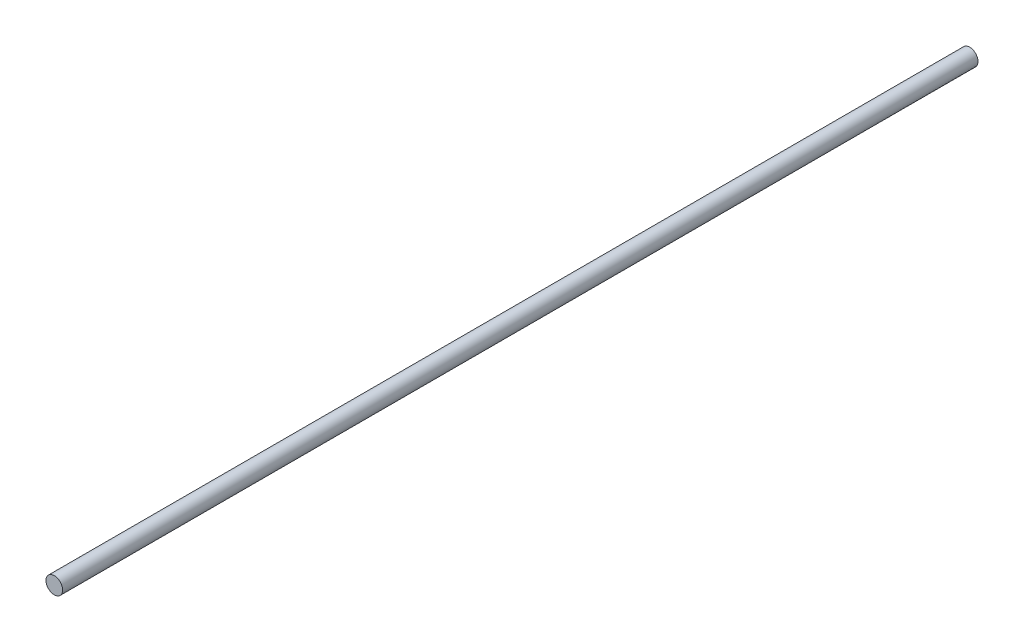
ISO-10303-21;
HEADER;
FILE_DESCRIPTION(('STEP AP214'),'2;1');
FILE_NAME('part.step','',(''),(''),'','','');
FILE_SCHEMA(('AUTOMOTIVE_DESIGN { 1 0 10303 214 1 1 1 1 }'));
ENDSEC;
DATA;
#1=APPLICATION_CONTEXT('core data for automotive mechanical design processes');
#2=APPLICATION_PROTOCOL_DEFINITION('international standard','automotive_design',2000,#1);
#3=PRODUCT_CONTEXT('',#1,'mechanical');
#4=PRODUCT('Part','Part','',(#3));
#5=PRODUCT_RELATED_PRODUCT_CATEGORY('part','',(#4));
#6=PRODUCT_DEFINITION_FORMATION('','',#4);
#7=PRODUCT_DEFINITION_CONTEXT('part definition',#1,'design');
#8=PRODUCT_DEFINITION('design','',#6,#7);
#9=PRODUCT_DEFINITION_SHAPE('','',#8);
#10=(LENGTH_UNIT() NAMED_UNIT(*) SI_UNIT(.MILLI.,.METRE.));
#11=(NAMED_UNIT(*) PLANE_ANGLE_UNIT() SI_UNIT($,.RADIAN.));
#12=(NAMED_UNIT(*) SI_UNIT($,.STERADIAN.) SOLID_ANGLE_UNIT());
#13=UNCERTAINTY_MEASURE_WITH_UNIT(LENGTH_MEASURE(1.E-05),#10,'distance_accuracy_value','');
#14=(GEOMETRIC_REPRESENTATION_CONTEXT(3) GLOBAL_UNCERTAINTY_ASSIGNED_CONTEXT((#13)) GLOBAL_UNIT_ASSIGNED_CONTEXT((#10,
#11,#12)) REPRESENTATION_CONTEXT('',''));
#15=CARTESIAN_POINT('',(0.,0.,0.));
#16=DIRECTION('',(0.,0.,1.));
#17=DIRECTION('',(1.,0.,0.));
#18=AXIS2_PLACEMENT_3D('',#15,#16,#17);
#19=CARTESIAN_POINT('',(0.,170.,-700.));
#20=DIRECTION('',(0.,0.,1.));
#21=DIRECTION('',(1.,0.,0.));
#22=AXIS2_PLACEMENT_3D('',#19,#20,#21);
#23=CYLINDRICAL_SURFACE('',#22,6.);
#24=CARTESIAN_POINT('',(0.,170.,-700.));
#25=DIRECTION('',(0.,0.,1.));
#26=DIRECTION('',(1.,0.,0.));
#27=AXIS2_PLACEMENT_3D('',#24,#25,#26);
#28=CIRCLE('',#27,6.);
#29=CARTESIAN_POINT('',(6.,170.,-700.));
#30=VERTEX_POINT('',#29);
#31=EDGE_CURVE('E10',#30,#30,#28,.T.);
#32=ORIENTED_EDGE('',*,*,#31,.T.);
#33=EDGE_LOOP('',(#32));
#34=FACE_BOUND('',#33,.T.);
#35=CARTESIAN_POINT('',(0.,170.,-40.));
#36=DIRECTION('',(0.,0.,1.));
#37=DIRECTION('',(1.,0.,0.));
#38=AXIS2_PLACEMENT_3D('',#35,#36,#37);
#39=CIRCLE('',#38,6.);
#40=CARTESIAN_POINT('',(6.,170.,-40.));
#41=VERTEX_POINT('',#40);
#42=EDGE_CURVE('E40',#41,#41,#39,.T.);
#43=ORIENTED_EDGE('',*,*,#42,.F.);
#44=EDGE_LOOP('',(#43));
#45=FACE_BOUND('',#44,.T.);
#46=ADVANCED_FACE('F37',(#34,#45),#23,.T.);
#47=CARTESIAN_POINT('',(0.,170.,-700.));
#48=DIRECTION('',(0.,0.,1.));
#49=DIRECTION('',(1.,0.,0.));
#50=AXIS2_PLACEMENT_3D('',#47,#48,#49);
#51=PLANE('',#50);
#52=ORIENTED_EDGE('',*,*,#31,.F.);
#53=EDGE_LOOP('',(#52));
#54=FACE_BOUND('',#53,.T.);
#55=ADVANCED_FACE('F52',(#54),#51,.F.);
#56=CARTESIAN_POINT('',(0.,170.,-40.));
#57=DIRECTION('',(0.,0.,1.));
#58=DIRECTION('',(1.,0.,0.));
#59=AXIS2_PLACEMENT_3D('',#56,#57,#58);
#60=PLANE('',#59);
#61=ORIENTED_EDGE('',*,*,#42,.T.);
#62=EDGE_LOOP('',(#61));
#63=FACE_BOUND('',#62,.T.);
#64=ADVANCED_FACE('F49',(#63),#60,.T.);
#65=CLOSED_SHELL('',(#46,#55,#64));
#66=MANIFOLD_SOLID_BREP('B2',#65);
#67=ADVANCED_BREP_SHAPE_REPRESENTATION('',(#18,#66),#14);
#68=SHAPE_DEFINITION_REPRESENTATION(#9,#67);
ENDSEC;
END-ISO-10303-21;
